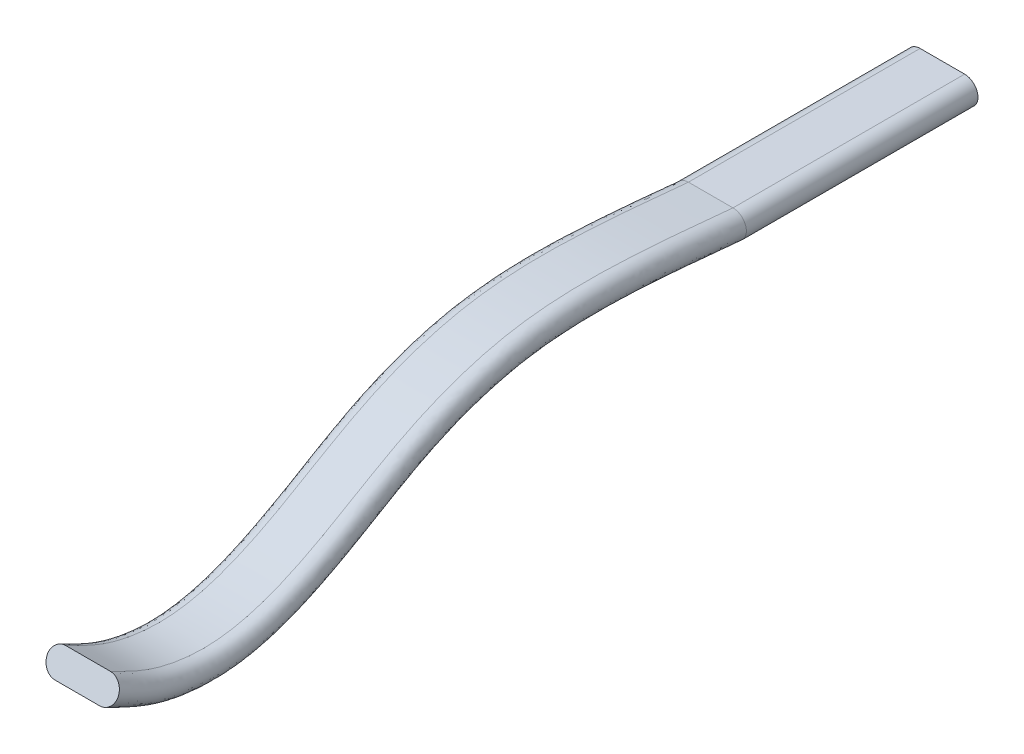
ISO-10303-21;
HEADER;
FILE_DESCRIPTION(('STEP AP214'),'2;1');
FILE_NAME('part.step','',(''),(''),'','','');
FILE_SCHEMA(('AUTOMOTIVE_DESIGN { 1 0 10303 214 1 1 1 1 }'));
ENDSEC;
DATA;
#1=APPLICATION_CONTEXT('core data for automotive mechanical design processes');
#2=APPLICATION_PROTOCOL_DEFINITION('international standard','automotive_design',2000,#1);
#3=PRODUCT_CONTEXT('',#1,'mechanical');
#4=PRODUCT('Part','Part','',(#3));
#5=PRODUCT_RELATED_PRODUCT_CATEGORY('part','',(#4));
#6=PRODUCT_DEFINITION_FORMATION('','',#4);
#7=PRODUCT_DEFINITION_CONTEXT('part definition',#1,'design');
#8=PRODUCT_DEFINITION('design','',#6,#7);
#9=PRODUCT_DEFINITION_SHAPE('','',#8);
#10=(LENGTH_UNIT() NAMED_UNIT(*) SI_UNIT(.MILLI.,.METRE.));
#11=(NAMED_UNIT(*) PLANE_ANGLE_UNIT() SI_UNIT($,.RADIAN.));
#12=(NAMED_UNIT(*) SI_UNIT($,.STERADIAN.) SOLID_ANGLE_UNIT());
#13=UNCERTAINTY_MEASURE_WITH_UNIT(LENGTH_MEASURE(1.E-05),#10,'distance_accuracy_value','');
#14=(GEOMETRIC_REPRESENTATION_CONTEXT(3) GLOBAL_UNCERTAINTY_ASSIGNED_CONTEXT((#13)) GLOBAL_UNIT_ASSIGNED_CONTEXT((#10,
#11,#12)) REPRESENTATION_CONTEXT('',''));
#15=CARTESIAN_POINT('',(0.,0.,0.));
#16=DIRECTION('',(0.,0.,1.));
#17=DIRECTION('',(1.,0.,0.));
#18=AXIS2_PLACEMENT_3D('',#15,#16,#17);
#19=CARTESIAN_POINT('',(0.526780099736162,-0.781783969892824,-2.67375336672806));
#20=DIRECTION('',(0.,0.,1.));
#21=DIRECTION('',(1.,0.,0.));
#22=AXIS2_PLACEMENT_3D('',#19,#20,#21);
#23=CYLINDRICAL_SURFACE('',#22,0.433928571428571);
#24=CARTESIAN_POINT('',(0.526780099736162,-0.781783969892824,4.84767520470051));
#25=DIRECTION('',(0.,0.,1.));
#26=DIRECTION('',(1.,0.,0.));
#27=AXIS2_PLACEMENT_3D('',#24,#25,#26);
#28=CIRCLE('',#27,0.433928571428571);
#29=CARTESIAN_POINT('',(0.526780099736162,-0.347855398464252,4.84767520470051));
#30=VERTEX_POINT('',#29);
#31=CARTESIAN_POINT('',(0.526780099736162,-1.2157125413214,4.84767520470051));
#32=VERTEX_POINT('',#31);
#33=EDGE_CURVE('E97',#30,#32,#28,.T.);
#34=ORIENTED_EDGE('',*,*,#33,.F.);
#35=DIRECTION('',(0.,0.,1.));
#36=VECTOR('',#35,1.);
#37=CARTESIAN_POINT('',(0.526780099736162,-0.347855398464252,-2.67375336672806));
#38=LINE('',#37,#36);
#39=CARTESIAN_POINT('',(0.526780099736162,-0.347855398464252,-2.67375336672806));
#40=VERTEX_POINT('',#39);
#41=EDGE_CURVE('E12',#40,#30,#38,.T.);
#42=ORIENTED_EDGE('',*,*,#41,.F.);
#43=CARTESIAN_POINT('',(0.526780099736162,-0.781783969892824,-2.67375336672806));
#44=DIRECTION('',(0.,0.,1.));
#45=DIRECTION('',(1.,0.,0.));
#46=AXIS2_PLACEMENT_3D('',#43,#44,#45);
#47=CIRCLE('',#46,0.433928571428571);
#48=CARTESIAN_POINT('',(0.526780099736162,-1.2157125413214,-2.67375336672806));
#49=VERTEX_POINT('',#48);
#50=EDGE_CURVE('E124',#40,#49,#47,.T.);
#51=ORIENTED_EDGE('',*,*,#50,.T.);
#52=DIRECTION('',(0.,0.,1.));
#53=VECTOR('',#52,1.);
#54=CARTESIAN_POINT('',(0.526780099736162,-1.2157125413214,-2.67375336672806));
#55=LINE('',#54,#53);
#56=EDGE_CURVE('E44',#49,#32,#55,.T.);
#57=ORIENTED_EDGE('',*,*,#56,.T.);
#58=EDGE_LOOP('',(#34,#42,#51,#57));
#59=FACE_BOUND('',#58,.T.);
#60=ADVANCED_FACE('F41',(#59),#23,.T.);
#61=CARTESIAN_POINT('',(0.526780099736162,-0.347855398464252,-2.67375336672806));
#62=DIRECTION('',(0.,1.,0.));
#63=DIRECTION('',(0.,0.,1.));
#64=AXIS2_PLACEMENT_3D('',#61,#62,#63);
#65=PLANE('',#64);
#66=DIRECTION('',(-1.,0.,0.));
#67=VECTOR('',#66,1.);
#68=CARTESIAN_POINT('',(0.526780099736162,-0.347855398464252,4.84767520470051));
#69=LINE('',#68,#67);
#70=CARTESIAN_POINT('',(1.97320867116473,-0.347855398464252,4.84767520470051));
#71=VERTEX_POINT('',#70);
#72=EDGE_CURVE('E109',#71,#30,#69,.T.);
#73=ORIENTED_EDGE('',*,*,#72,.F.);
#74=DIRECTION('',(0.,0.,1.));
#75=VECTOR('',#74,1.);
#76=CARTESIAN_POINT('',(1.97320867116473,-0.347855398464252,-2.67375336672806));
#77=LINE('',#76,#75);
#78=CARTESIAN_POINT('',(1.97320867116473,-0.347855398464252,-2.67375336672806));
#79=VERTEX_POINT('',#78);
#80=EDGE_CURVE('E50',#79,#71,#77,.T.);
#81=ORIENTED_EDGE('',*,*,#80,.F.);
#82=DIRECTION('',(-1.,0.,0.));
#83=VECTOR('',#82,1.);
#84=CARTESIAN_POINT('',(0.526780099736162,-0.347855398464252,-2.67375336672806));
#85=LINE('',#84,#83);
#86=EDGE_CURVE('E112',#79,#40,#85,.T.);
#87=ORIENTED_EDGE('',*,*,#86,.T.);
#88=ORIENTED_EDGE('',*,*,#41,.T.);
#89=EDGE_LOOP('',(#73,#81,#87,#88));
#90=FACE_BOUND('',#89,.T.);
#91=ADVANCED_FACE('F107',(#90),#65,.T.);
#92=CARTESIAN_POINT('',(1.97320867116473,-0.781783969892824,-2.67375336672806));
#93=DIRECTION('',(0.,0.,1.));
#94=DIRECTION('',(1.,0.,0.));
#95=AXIS2_PLACEMENT_3D('',#92,#93,#94);
#96=CYLINDRICAL_SURFACE('',#95,0.433928571428571);
#97=CARTESIAN_POINT('',(1.97320867116473,-0.781783969892824,4.84767520470051));
#98=DIRECTION('',(0.,0.,1.));
#99=DIRECTION('',(1.,0.,0.));
#100=AXIS2_PLACEMENT_3D('',#97,#98,#99);
#101=CIRCLE('',#100,0.433928571428571);
#102=CARTESIAN_POINT('',(1.97320867116473,-1.2157125413214,4.84767520470051));
#103=VERTEX_POINT('',#102);
#104=EDGE_CURVE('E125',#103,#71,#101,.T.);
#105=ORIENTED_EDGE('',*,*,#104,.F.);
#106=DIRECTION('',(0.,0.,1.));
#107=VECTOR('',#106,1.);
#108=CARTESIAN_POINT('',(1.97320867116473,-1.2157125413214,-2.67375336672806));
#109=LINE('',#108,#107);
#110=CARTESIAN_POINT('',(1.97320867116473,-1.2157125413214,-2.67375336672806));
#111=VERTEX_POINT('',#110);
#112=EDGE_CURVE('E73',#111,#103,#109,.T.);
#113=ORIENTED_EDGE('',*,*,#112,.F.);
#114=CARTESIAN_POINT('',(1.97320867116473,-0.781783969892824,-2.67375336672806));
#115=DIRECTION('',(0.,0.,1.));
#116=DIRECTION('',(1.,0.,0.));
#117=AXIS2_PLACEMENT_3D('',#114,#115,#116);
#118=CIRCLE('',#117,0.433928571428571);
#119=EDGE_CURVE('E132',#111,#79,#118,.T.);
#120=ORIENTED_EDGE('',*,*,#119,.T.);
#121=ORIENTED_EDGE('',*,*,#80,.T.);
#122=EDGE_LOOP('',(#105,#113,#120,#121));
#123=FACE_BOUND('',#122,.T.);
#124=ADVANCED_FACE('F168',(#123),#96,.T.);
#125=CARTESIAN_POINT('',(0.526780099736162,-1.2157125413214,-2.67375336672806));
#126=DIRECTION('',(0.,-1.,0.));
#127=DIRECTION('',(0.,0.,-1.));
#128=AXIS2_PLACEMENT_3D('',#125,#126,#127);
#129=PLANE('',#128);
#130=DIRECTION('',(1.,0.,0.));
#131=VECTOR('',#130,1.);
#132=CARTESIAN_POINT('',(0.526780099736162,-1.2157125413214,4.84767520470051));
#133=LINE('',#132,#131);
#134=EDGE_CURVE('E102',#32,#103,#133,.T.);
#135=ORIENTED_EDGE('',*,*,#134,.F.);
#136=ORIENTED_EDGE('',*,*,#56,.F.);
#137=DIRECTION('',(1.,0.,0.));
#138=VECTOR('',#137,1.);
#139=CARTESIAN_POINT('',(0.526780099736162,-1.2157125413214,-2.67375336672806));
#140=LINE('',#139,#138);
#141=EDGE_CURVE('E127',#49,#111,#140,.T.);
#142=ORIENTED_EDGE('',*,*,#141,.T.);
#143=ORIENTED_EDGE('',*,*,#112,.T.);
#144=EDGE_LOOP('',(#135,#136,#142,#143));
#145=FACE_BOUND('',#144,.T.);
#146=ADVANCED_FACE('F164',(#145),#129,.T.);
#147=CARTESIAN_POINT('',(0.526780099736162,-0.781783969892824,-2.67375336672806));
#148=DIRECTION('',(0.,0.,1.));
#149=DIRECTION('',(1.,0.,0.));
#150=AXIS2_PLACEMENT_3D('',#147,#148,#149);
#151=PLANE('',#150);
#152=ORIENTED_EDGE('',*,*,#50,.F.);
#153=ORIENTED_EDGE('',*,*,#86,.F.);
#154=ORIENTED_EDGE('',*,*,#119,.F.);
#155=ORIENTED_EDGE('',*,*,#141,.F.);
#156=EDGE_LOOP('',(#152,#153,#154,#155));
#157=FACE_BOUND('',#156,.T.);
#158=ADVANCED_FACE('F167',(#157),#151,.F.);
#159=CARTESIAN_POINT('',(0.526780099736162,-3.66872584479644,25.2398042038047));
#160=DIRECTION('',(0.,0.404384129111908,0.914589239015201));
#161=DIRECTION('',(1.,0.,0.));
#162=AXIS2_PLACEMENT_3D('',#159,#160,#161);
#163=PLANE('',#162);
#164=CARTESIAN_POINT('',(0.526780099736162,-3.66872584479644,25.2398042038047));
#165=DIRECTION('',(0.,0.404384129111908,0.914589239015201));
#166=DIRECTION('',(1.,0.,0.));
#167=AXIS2_PLACEMENT_3D('',#164,#165,#166);
#168=CIRCLE('',#167,0.433928571428571);
#169=CARTESIAN_POINT('',(0.526780099736162,-3.27185944286663,25.0643303763508));
#170=VERTEX_POINT('',#169);
#171=CARTESIAN_POINT('',(0.526780099736161,-4.06559224672626,25.4152780312586));
#172=VERTEX_POINT('',#171);
#173=EDGE_CURVE('E117',#170,#172,#168,.T.);
#174=ORIENTED_EDGE('',*,*,#173,.T.);
#175=DIRECTION('',(1.,0.,0.));
#176=VECTOR('',#175,1.);
#177=CARTESIAN_POINT('',(0.526780099736161,-4.06559224672626,25.4152780312586));
#178=LINE('',#177,#176);
#179=CARTESIAN_POINT('',(1.97320867116473,-4.06559224672626,25.4152780312586));
#180=VERTEX_POINT('',#179);
#181=EDGE_CURVE('E275',#172,#180,#178,.T.);
#182=ORIENTED_EDGE('',*,*,#181,.T.);
#183=CARTESIAN_POINT('',(1.97320867116473,-3.66872584479645,25.2398042038047));
#184=DIRECTION('',(0.,0.404384129111908,0.914589239015201));
#185=DIRECTION('',(1.,0.,0.));
#186=AXIS2_PLACEMENT_3D('',#183,#184,#185);
#187=CIRCLE('',#186,0.433928571428571);
#188=CARTESIAN_POINT('',(1.97320867116473,-3.27185944286663,25.0643303763508));
#189=VERTEX_POINT('',#188);
#190=EDGE_CURVE('E147',#180,#189,#187,.T.);
#191=ORIENTED_EDGE('',*,*,#190,.T.);
#192=DIRECTION('',(-1.,0.,0.));
#193=VECTOR('',#192,1.);
#194=CARTESIAN_POINT('',(0.526780099736162,-3.27185944286663,25.0643303763508));
#195=LINE('',#194,#193);
#196=EDGE_CURVE('E150',#189,#170,#195,.T.);
#197=ORIENTED_EDGE('',*,*,#196,.T.);
#198=EDGE_LOOP('',(#174,#182,#191,#197));
#199=FACE_BOUND('',#198,.T.);
#200=ADVANCED_FACE('F202',(#199),#163,.T.);
#201=CARTESIAN_POINT('',(1.97320867116473,-0.347855398464252,4.84767520470051));
#202=CARTESIAN_POINT('',(1.97320867116473,-0.237773598344045,6.0228038470855));
#203=CARTESIAN_POINT('',(1.97320867116473,0.00191392639273234,8.33560544019088));
#204=CARTESIAN_POINT('',(1.97320867116473,-0.0163151759276791,12.052337814414));
#205=CARTESIAN_POINT('',(1.97320867116473,-1.13584551232427,15.2310981323531));
#206=CARTESIAN_POINT('',(1.97320867116473,-2.72627650517268,17.7772754686209));
#207=CARTESIAN_POINT('',(1.97320867116473,-3.66235989034802,19.5806596124063));
#208=CARTESIAN_POINT('',(1.97320867116473,-4.0535019938743,20.9604301286208));
#209=CARTESIAN_POINT('',(1.97320867116473,-4.16819108851048,21.9015605817675));
#210=CARTESIAN_POINT('',(1.97320867116473,-4.10261746977848,22.8832451794184));
#211=CARTESIAN_POINT('',(1.97320867116473,-3.85030214273174,23.9197344161867));
#212=CARTESIAN_POINT('',(1.97320867116473,-3.464673676155,24.6827983896294));
#213=CARTESIAN_POINT('',(1.97320867116473,-3.27185944286663,25.0643303763508));
#214=CARTESIAN_POINT('',(1.49106581402188,-0.347855398464252,4.84767520470051));
#215=CARTESIAN_POINT('',(1.49106581402188,-0.237184411622656,6.02909344437826));
#216=CARTESIAN_POINT('',(1.49106581402188,0.00164026478433113,8.33268408903199));
#217=CARTESIAN_POINT('',(1.49106581402188,-0.0162411403803595,12.053128147531));
#218=CARTESIAN_POINT('',(1.49106581402188,-1.13585994989446,15.2309440105797));
#219=CARTESIAN_POINT('',(1.49106581402188,-2.72627302030837,17.7773126697192));
#220=CARTESIAN_POINT('',(1.49106581402188,-3.66236022867955,19.5806560007006));
#221=CARTESIAN_POINT('',(1.49106581402188,-4.05350193839388,20.9604307208771));
#222=CARTESIAN_POINT('',(1.49106581402188,-4.16819110337131,21.9015604231274));
#223=CARTESIAN_POINT('',(1.49106581402188,-4.10261746581559,22.8832452217225));
#224=CARTESIAN_POINT('',(1.49106581402188,-3.85030214372246,23.9197344056107));
#225=CARTESIAN_POINT('',(1.49106581402188,-3.46467367648524,24.6827983861041));
#226=CARTESIAN_POINT('',(1.49106581402188,-3.27185944286663,25.0643303763508));
#227=CARTESIAN_POINT('',(1.00892295687902,-0.347855398464252,4.84767520470051));
#228=CARTESIAN_POINT('',(1.00892295687902,-0.237184411622656,6.02909344437826));
#229=CARTESIAN_POINT('',(1.00892295687902,0.001640264784331,8.33268408903199));
#230=CARTESIAN_POINT('',(1.00892295687902,-0.016241140380359,12.053128147531));
#231=CARTESIAN_POINT('',(1.00892295687902,-1.13585994989446,15.2309440105797));
#232=CARTESIAN_POINT('',(1.00892295687902,-2.72627302030837,17.7773126697192));
#233=CARTESIAN_POINT('',(1.00892295687902,-3.66236022867955,19.5806560007006));
#234=CARTESIAN_POINT('',(1.00892295687902,-4.05350193839387,20.9604307208771));
#235=CARTESIAN_POINT('',(1.00892295687902,-4.16819110337131,21.9015604231274));
#236=CARTESIAN_POINT('',(1.00892295687902,-4.10261746581559,22.8832452217225));
#237=CARTESIAN_POINT('',(1.00892295687902,-3.85030214372246,23.9197344056107));
#238=CARTESIAN_POINT('',(1.00892295687902,-3.46467367648524,24.6827983861041));
#239=CARTESIAN_POINT('',(1.00892295687902,-3.27185944286663,25.0643303763508));
#240=CARTESIAN_POINT('',(0.526780099736162,-0.347855398464252,4.84767520470051));
#241=CARTESIAN_POINT('',(0.526780099736162,-0.237773598344045,6.0228038470855));
#242=CARTESIAN_POINT('',(0.526780099736161,0.00191392639273183,8.33560544019088));
#243=CARTESIAN_POINT('',(0.526780099736162,-0.0163151759276774,12.052337814414));
#244=CARTESIAN_POINT('',(0.526780099736162,-1.13584551232427,15.2310981323531));
#245=CARTESIAN_POINT('',(0.526780099736162,-2.72627650517268,17.7772754686209));
#246=CARTESIAN_POINT('',(0.526780099736162,-3.66235989034802,19.5806596124063));
#247=CARTESIAN_POINT('',(0.526780099736162,-4.0535019938743,20.9604301286208));
#248=CARTESIAN_POINT('',(0.526780099736162,-4.16819108851048,21.9015605817675));
#249=CARTESIAN_POINT('',(0.526780099736162,-4.10261746977848,22.8832451794184));
#250=CARTESIAN_POINT('',(0.526780099736162,-3.85030214273174,23.9197344161867));
#251=CARTESIAN_POINT('',(0.526780099736162,-3.464673676155,24.6827983896294));
#252=CARTESIAN_POINT('',(0.526780099736162,-3.27185944286663,25.0643303763508));
#253=B_SPLINE_SURFACE_WITH_KNOTS('',3,3,((#201,#202,#203,#204,#205,#206,#207,#208,#209,#210,
#211,#212,#213),(#214,#215,#216,#217,#218,#219,#220,#221,#222,#223,#224,#225,#226),(#227,#228,
#229,#230,#231,#232,#233,#234,#235,#236,#237,#238,#239),(#240,#241,#242,#243,#244,#245,#246,
#247,#248,#249,#250,#251,#252)),.UNSPECIFIED.,.F.,.F.,.F.,(4,4),(4,1,1,1,1,1,1,1,1,1,4),(0.6875,
1.),(0.,0.166666666666668,0.333333333333294,0.5,0.625,0.75,0.8,0.85,0.9,0.95,1.),.UNSPECIFIED.);
#254=CARTESIAN_POINT('',(0.526780099736161,-0.347855398464252,4.84767520470051));
#255=CARTESIAN_POINT('',(0.526780099736161,-0.237773598344045,6.0228038470855));
#256=CARTESIAN_POINT('',(0.526780099736161,0.00191392639273171,8.33560544019088));
#257=CARTESIAN_POINT('',(0.526780099736162,-0.0163151759276775,12.052337814414));
#258=CARTESIAN_POINT('',(0.526780099736162,-1.13584551232427,15.2310981323531));
#259=CARTESIAN_POINT('',(0.526780099736162,-2.72627650517268,17.7772754686209));
#260=CARTESIAN_POINT('',(0.526780099736162,-3.66235989034802,19.5806596124063));
#261=CARTESIAN_POINT('',(0.526780099736162,-4.0535019938743,20.9604301286208));
#262=CARTESIAN_POINT('',(0.526780099736162,-4.16819108851048,21.9015605817675));
#263=CARTESIAN_POINT('',(0.526780099736162,-4.10261746977848,22.8832451794184));
#264=CARTESIAN_POINT('',(0.526780099736162,-3.85030214273174,23.9197344161867));
#265=CARTESIAN_POINT('',(0.526780099736162,-3.464673676155,24.6827983896294));
#266=CARTESIAN_POINT('',(0.526780099736162,-3.27185944286663,25.0643303763508));
#267=B_SPLINE_CURVE_WITH_KNOTS('',3,(#254,#255,#256,#257,#258,#259,#260,#261,#262,#263,#264,
#265,#266),.UNSPECIFIED.,.F.,.F.,(4,1,1,1,1,1,1,1,1,1,4),(0.,0.166666666666668,
0.333333333333294,0.5,0.625,0.75,0.8,0.85,0.9,0.95,1.),.UNSPECIFIED.);
#268=EDGE_CURVE('E103',#30,#170,#267,.T.);
#269=CARTESIAN_POINT('',(1.97320867116473,-0.347855398464252,4.84767520470051));
#270=CARTESIAN_POINT('',(1.97320867116473,-0.237773598344045,6.0228038470855));
#271=CARTESIAN_POINT('',(1.97320867116473,0.00191392639273234,8.33560544019088));
#272=CARTESIAN_POINT('',(1.97320867116473,-0.0163151759276791,12.052337814414));
#273=CARTESIAN_POINT('',(1.97320867116473,-1.13584551232427,15.2310981323531));
#274=CARTESIAN_POINT('',(1.97320867116473,-2.72627650517268,17.7772754686209));
#275=CARTESIAN_POINT('',(1.97320867116473,-3.66235989034802,19.5806596124063));
#276=CARTESIAN_POINT('',(1.97320867116473,-4.0535019938743,20.9604301286208));
#277=CARTESIAN_POINT('',(1.97320867116473,-4.16819108851048,21.9015605817675));
#278=CARTESIAN_POINT('',(1.97320867116473,-4.10261746977848,22.8832451794184));
#279=CARTESIAN_POINT('',(1.97320867116473,-3.85030214273174,23.9197344161867));
#280=CARTESIAN_POINT('',(1.97320867116473,-3.464673676155,24.6827983896294));
#281=CARTESIAN_POINT('',(1.97320867116473,-3.27185944286663,25.0643303763508));
#282=B_SPLINE_CURVE_WITH_KNOTS('',3,(#269,#270,#271,#272,#273,#274,#275,#276,#277,#278,#279,
#280,#281),.UNSPECIFIED.,.F.,.F.,(4,1,1,1,1,1,1,1,1,1,4),(0.,0.166666666666668,
0.333333333333294,0.5,0.625,0.75,0.8,0.85,0.9,0.95,1.),.UNSPECIFIED.);
#283=EDGE_CURVE('E120',#71,#189,#282,.T.);
#284=ORIENTED_EDGE('',*,*,#72,.T.);
#285=ORIENTED_EDGE('',*,*,#268,.T.);
#286=ORIENTED_EDGE('',*,*,#196,.F.);
#287=ORIENTED_EDGE('',*,*,#283,.F.);
#288=EDGE_LOOP('',(#284,#285,#286,#287));
#289=FACE_BOUND('',#288,.T.);
#290=ADVANCED_FACE('F123',(#289),#253,.T.);
#291=CARTESIAN_POINT('',(1.97320867116473,-1.2157125413214,4.84767520470051));
#292=CARTESIAN_POINT('',(1.97320867116473,-1.10690338451939,6.00921831693315));
#293=CARTESIAN_POINT('',(1.97320867116473,-0.863653721038825,8.32408971589233));
#294=CARTESIAN_POINT('',(1.97320867116473,-0.884419271779599,11.866109309463));
#295=CARTESIAN_POINT('',(1.97320867116473,-1.85820005422457,14.7346256120417));
#296=CARTESIAN_POINT('',(1.97320867116473,-3.41742349233677,17.2563195628657));
#297=CARTESIAN_POINT('',(1.97320867116473,-4.42568774009674,19.1530263808066));
#298=CARTESIAN_POINT('',(1.97320867116473,-4.88489432347439,20.6992844671516));
#299=CARTESIAN_POINT('',(1.97320867116473,-5.03350996834479,21.7870192793937));
#300=CARTESIAN_POINT('',(1.97320867116473,-4.97428411611862,22.9362333390928));
#301=CARTESIAN_POINT('',(1.97320867116473,-4.69584950072705,24.1385339059814));
#302=CARTESIAN_POINT('',(1.97320867116473,-4.27567799805985,24.9896966561662));
#303=CARTESIAN_POINT('',(1.97320867116473,-4.06559224672626,25.4152780312586));
#304=CARTESIAN_POINT('',(2.84106581402188,-1.2157125413214,4.84767520470051));
#305=CARTESIAN_POINT('',(2.84106581402188,-1.10654987248656,6.01299207530881));
#306=CARTESIAN_POINT('',(2.84106581402188,-0.863817918003865,8.322336905197));
#307=CARTESIAN_POINT('',(2.84106581402187,-0.884374850451208,11.8665835093332));
#308=CARTESIAN_POINT('',(2.84106581402188,-1.85820871676668,14.7345331389777));
#309=CARTESIAN_POINT('',(2.84106581402188,-3.41742140141818,17.2563418835246));
#310=CARTESIAN_POINT('',(2.84106581402187,-4.42568794309566,19.1530242137831));
#311=CARTESIAN_POINT('',(2.84106581402188,-4.88489429018613,20.6992848225054));
#312=CARTESIAN_POINT('',(2.84106581402188,-5.03350997726129,21.7870191842096));
#313=CARTESIAN_POINT('',(2.84106581402188,-4.97428411374089,22.9362333644752));
#314=CARTESIAN_POINT('',(2.84106581402188,-4.69584950132149,24.1385338996358));
#315=CARTESIAN_POINT('',(2.84106581402188,-4.275677998258,24.989696654051));
#316=CARTESIAN_POINT('',(2.84106581402188,-4.06559224672626,25.4152780312586));
#317=CARTESIAN_POINT('',(2.84106581402188,-0.347855398464252,4.84767520470051));
#318=CARTESIAN_POINT('',(2.84106581402188,-0.238127110376879,6.01903008870985));
#319=CARTESIAN_POINT('',(2.84106581402187,0.00207812335777261,8.3373582508862));
#320=CARTESIAN_POINT('',(2.84106581402188,-0.0163595972560713,12.0518636145438));
#321=CARTESIAN_POINT('',(2.84106581402188,-1.13583684978215,15.2311906054172));
#322=CARTESIAN_POINT('',(2.84106581402188,-2.72627859609126,17.7772531479619));
#323=CARTESIAN_POINT('',(2.84106581402188,-3.6623596873491,19.5806617794298));
#324=CARTESIAN_POINT('',(2.84106581402188,-4.05350202716256,20.960429773267));
#325=CARTESIAN_POINT('',(2.84106581402188,-4.16819107959398,21.9015606769515));
#326=CARTESIAN_POINT('',(2.84106581402188,-4.10261747215621,22.883245154036));
#327=CARTESIAN_POINT('',(2.84106581402188,-3.85030214213731,23.9197344225323));
#328=CARTESIAN_POINT('',(2.84106581402188,-3.46467367595686,24.6827983917446));
#329=CARTESIAN_POINT('',(2.84106581402188,-3.27185944286664,25.0643303763508));
#330=CARTESIAN_POINT('',(1.97320867116473,-0.347855398464252,4.84767520470051));
#331=CARTESIAN_POINT('',(1.97320867116473,-0.237773598344045,6.0228038470855));
#332=CARTESIAN_POINT('',(1.97320867116473,0.00191392639273234,8.33560544019088));
#333=CARTESIAN_POINT('',(1.97320867116473,-0.0163151759276791,12.052337814414));
#334=CARTESIAN_POINT('',(1.97320867116473,-1.13584551232427,15.2310981323531));
#335=CARTESIAN_POINT('',(1.97320867116473,-2.72627650517268,17.7772754686209));
#336=CARTESIAN_POINT('',(1.97320867116473,-3.66235989034802,19.5806596124063));
#337=CARTESIAN_POINT('',(1.97320867116473,-4.0535019938743,20.9604301286208));
#338=CARTESIAN_POINT('',(1.97320867116473,-4.16819108851048,21.9015605817675));
#339=CARTESIAN_POINT('',(1.97320867116473,-4.10261746977848,22.8832451794184));
#340=CARTESIAN_POINT('',(1.97320867116473,-3.85030214273174,23.9197344161867));
#341=CARTESIAN_POINT('',(1.97320867116473,-3.464673676155,24.6827983896294));
#342=CARTESIAN_POINT('',(1.97320867116473,-3.27185944286663,25.0643303763508));
#343=(BOUNDED_SURFACE() B_SPLINE_SURFACE(3,3,((#291,#292,#293,#294,#295,#296,#297,#298,#299,
#300,#301,#302,#303),(#304,#305,#306,#307,#308,#309,#310,#311,#312,#313,#314,#315,#316),(#317,
#318,#319,#320,#321,#322,#323,#324,#325,#326,#327,#328,#329),(#330,#331,#332,#333,#334,#335,
#336,#337,#338,#339,#340,#341,#342)),.UNSPECIFIED.,.F.,.F.,.F.) B_SPLINE_SURFACE_WITH_KNOTS((4,
4),(4,1,1,1,1,1,1,1,1,1,4),(0.5,0.6875),(0.,0.166666666666668,0.333333333333294,0.5,0.625,0.75,
0.8,0.85,0.9,0.95,1.),
.UNSPECIFIED.) GEOMETRIC_REPRESENTATION_ITEM() RATIONAL_B_SPLINE_SURFACE(((1.,1.,1.,1.,1.,1.,1.,
1.,1.,1.,1.,1.,1.),(0.333333333333333,0.333333333333333,0.333333333333333,0.333333333333333,
0.333333333333333,0.333333333333333,0.333333333333333,0.333333333333333,0.333333333333333,
0.333333333333333,0.333333333333333,0.333333333333333,0.333333333333333),(0.333333333333333,
0.333333333333333,0.333333333333333,0.333333333333333,0.333333333333333,0.333333333333333,
0.333333333333333,0.333333333333333,0.333333333333333,0.333333333333333,0.333333333333333,
0.333333333333333,0.333333333333333),(1.,1.,1.,1.,1.,1.,1.,1.,1.,1.,1.,1.,1.))) REPRESENTATION_ITEM('') SURFACE());
#344=CARTESIAN_POINT('',(1.97320867116473,-1.2157125413214,4.84767520470051));
#345=CARTESIAN_POINT('',(1.97320867116473,-1.10690338451939,6.00921831693315));
#346=CARTESIAN_POINT('',(1.97320867116473,-0.863653721038825,8.32408971589233));
#347=CARTESIAN_POINT('',(1.97320867116473,-0.884419271779599,11.866109309463));
#348=CARTESIAN_POINT('',(1.97320867116473,-1.85820005422457,14.7346256120417));
#349=CARTESIAN_POINT('',(1.97320867116473,-3.41742349233677,17.2563195628657));
#350=CARTESIAN_POINT('',(1.97320867116473,-4.42568774009674,19.1530263808066));
#351=CARTESIAN_POINT('',(1.97320867116473,-4.88489432347439,20.6992844671516));
#352=CARTESIAN_POINT('',(1.97320867116473,-5.03350996834479,21.7870192793936));
#353=CARTESIAN_POINT('',(1.97320867116473,-4.97428411611862,22.9362333390928));
#354=CARTESIAN_POINT('',(1.97320867116473,-4.69584950072705,24.1385339059814));
#355=CARTESIAN_POINT('',(1.97320867116473,-4.27567799805985,24.9896966561662));
#356=CARTESIAN_POINT('',(1.97320867116473,-4.06559224672626,25.4152780312586));
#357=B_SPLINE_CURVE_WITH_KNOTS('',3,(#344,#345,#346,#347,#348,#349,#350,#351,#352,#353,#354,
#355,#356),.UNSPECIFIED.,.F.,.F.,(4,1,1,1,1,1,1,1,1,1,4),(0.,0.166666666666668,
0.333333333333294,0.5,0.625,0.75,0.8,0.85,0.9,0.95,1.),.UNSPECIFIED.);
#358=EDGE_CURVE('E141',#103,#180,#357,.T.);
#359=ORIENTED_EDGE('',*,*,#104,.T.);
#360=ORIENTED_EDGE('',*,*,#283,.T.);
#361=ORIENTED_EDGE('',*,*,#190,.F.);
#362=ORIENTED_EDGE('',*,*,#358,.F.);
#363=EDGE_LOOP('',(#359,#360,#361,#362));
#364=FACE_BOUND('',#363,.T.);
#365=ADVANCED_FACE('F145',(#364),#343,.T.);
#366=CARTESIAN_POINT('',(0.526780099736162,-1.2157125413214,4.84767520470051));
#367=CARTESIAN_POINT('',(0.526780099736162,-1.10690338451939,6.00921831693315));
#368=CARTESIAN_POINT('',(0.526780099736162,-0.863653721038825,8.32408971589233));
#369=CARTESIAN_POINT('',(0.526780099736161,-0.884419271779597,11.866109309463));
#370=CARTESIAN_POINT('',(0.526780099736161,-1.85820005422457,14.7346256120417));
#371=CARTESIAN_POINT('',(0.526780099736161,-3.41742349233677,17.2563195628657));
#372=CARTESIAN_POINT('',(0.526780099736161,-4.42568774009674,19.1530263808066));
#373=CARTESIAN_POINT('',(0.526780099736161,-4.88489432347439,20.6992844671516));
#374=CARTESIAN_POINT('',(0.526780099736161,-5.03350996834479,21.7870192793936));
#375=CARTESIAN_POINT('',(0.526780099736161,-4.97428411611862,22.9362333390928));
#376=CARTESIAN_POINT('',(0.526780099736161,-4.69584950072705,24.1385339059814));
#377=CARTESIAN_POINT('',(0.526780099736161,-4.27567799805985,24.9896966561662));
#378=CARTESIAN_POINT('',(0.526780099736161,-4.06559224672626,25.4152780312586));
#379=CARTESIAN_POINT('',(1.00892295687902,-1.2157125413214,4.84767520470051));
#380=CARTESIAN_POINT('',(1.00892295687902,-1.10749257124078,6.0029287196404));
#381=CARTESIAN_POINT('',(1.00892295687902,-0.863380059430424,8.32701106705121));
#382=CARTESIAN_POINT('',(1.00892295687902,-0.884493307326917,11.865318976346));
#383=CARTESIAN_POINT('',(1.00892295687902,-1.85818561665437,14.7347797338152));
#384=CARTESIAN_POINT('',(1.00892295687902,-3.41742697720107,17.2562823617674));
#385=CARTESIAN_POINT('',(1.00892295687902,-4.42568740176521,19.1530299925124));
#386=CARTESIAN_POINT('',(1.00892295687902,-4.88489437895482,20.6992838748953));
#387=CARTESIAN_POINT('',(1.00892295687902,-5.03350995348396,21.7870194380337));
#388=CARTESIAN_POINT('',(1.00892295687902,-4.97428412008151,22.9362332967888));
#389=CARTESIAN_POINT('',(1.00892295687902,-4.69584949973633,24.1385339165574));
#390=CARTESIAN_POINT('',(1.00892295687902,-4.27567799772961,24.9896966596915));
#391=CARTESIAN_POINT('',(1.00892295687902,-4.06559224672626,25.4152780312586));
#392=CARTESIAN_POINT('',(1.49106581402188,-1.2157125413214,4.84767520470051));
#393=CARTESIAN_POINT('',(1.49106581402188,-1.10749257124078,6.0029287196404));
#394=CARTESIAN_POINT('',(1.49106581402188,-0.863380059430424,8.32701106705121));
#395=CARTESIAN_POINT('',(1.49106581402188,-0.884493307326917,11.865318976346));
#396=CARTESIAN_POINT('',(1.49106581402188,-1.85818561665437,14.7347797338152));
#397=CARTESIAN_POINT('',(1.49106581402188,-3.41742697720107,17.2562823617674));
#398=CARTESIAN_POINT('',(1.49106581402188,-4.42568740176521,19.1530299925124));
#399=CARTESIAN_POINT('',(1.49106581402188,-4.88489437895482,20.6992838748953));
#400=CARTESIAN_POINT('',(1.49106581402188,-5.03350995348396,21.7870194380337));
#401=CARTESIAN_POINT('',(1.49106581402188,-4.97428412008151,22.9362332967888));
#402=CARTESIAN_POINT('',(1.49106581402188,-4.69584949973633,24.1385339165574));
#403=CARTESIAN_POINT('',(1.49106581402188,-4.27567799772961,24.9896966596915));
#404=CARTESIAN_POINT('',(1.49106581402188,-4.06559224672626,25.4152780312586));
#405=CARTESIAN_POINT('',(1.97320867116473,-1.2157125413214,4.84767520470051));
#406=CARTESIAN_POINT('',(1.97320867116473,-1.10690338451939,6.00921831693315));
#407=CARTESIAN_POINT('',(1.97320867116473,-0.863653721038825,8.32408971589233));
#408=CARTESIAN_POINT('',(1.97320867116473,-0.884419271779599,11.866109309463));
#409=CARTESIAN_POINT('',(1.97320867116473,-1.85820005422457,14.7346256120417));
#410=CARTESIAN_POINT('',(1.97320867116473,-3.41742349233677,17.2563195628657));
#411=CARTESIAN_POINT('',(1.97320867116473,-4.42568774009674,19.1530263808066));
#412=CARTESIAN_POINT('',(1.97320867116473,-4.88489432347439,20.6992844671516));
#413=CARTESIAN_POINT('',(1.97320867116473,-5.03350996834479,21.7870192793936));
#414=CARTESIAN_POINT('',(1.97320867116473,-4.97428411611862,22.9362333390928));
#415=CARTESIAN_POINT('',(1.97320867116473,-4.69584950072705,24.1385339059814));
#416=CARTESIAN_POINT('',(1.97320867116473,-4.27567799805985,24.9896966561662));
#417=CARTESIAN_POINT('',(1.97320867116473,-4.06559224672626,25.4152780312586));
#418=B_SPLINE_SURFACE_WITH_KNOTS('',3,3,((#366,#367,#368,#369,#370,#371,#372,#373,#374,#375,
#376,#377,#378),(#379,#380,#381,#382,#383,#384,#385,#386,#387,#388,#389,#390,#391),(#392,#393,
#394,#395,#396,#397,#398,#399,#400,#401,#402,#403,#404),(#405,#406,#407,#408,#409,#410,#411,
#412,#413,#414,#415,#416,#417)),.UNSPECIFIED.,.F.,.F.,.F.,(4,4),(4,1,1,1,1,1,1,1,1,1,4),(0.1875,
0.5),(0.,0.166666666666668,0.333333333333294,0.5,0.625,0.75,0.8,0.85,0.9,0.95,1.),.UNSPECIFIED.);
#419=CARTESIAN_POINT('',(0.526780099736162,-1.2157125413214,4.84767520470051));
#420=CARTESIAN_POINT('',(0.526780099736162,-1.10690338451939,6.00921831693315));
#421=CARTESIAN_POINT('',(0.526780099736162,-0.863653721038825,8.32408971589233));
#422=CARTESIAN_POINT('',(0.526780099736161,-0.884419271779597,11.866109309463));
#423=CARTESIAN_POINT('',(0.526780099736161,-1.85820005422457,14.7346256120417));
#424=CARTESIAN_POINT('',(0.526780099736161,-3.41742349233677,17.2563195628657));
#425=CARTESIAN_POINT('',(0.526780099736161,-4.42568774009674,19.1530263808066));
#426=CARTESIAN_POINT('',(0.526780099736161,-4.88489432347439,20.6992844671516));
#427=CARTESIAN_POINT('',(0.526780099736161,-5.03350996834479,21.7870192793936));
#428=CARTESIAN_POINT('',(0.526780099736161,-4.97428411611862,22.9362333390928));
#429=CARTESIAN_POINT('',(0.526780099736161,-4.69584950072705,24.1385339059814));
#430=CARTESIAN_POINT('',(0.526780099736161,-4.27567799805985,24.9896966561662));
#431=CARTESIAN_POINT('',(0.526780099736161,-4.06559224672626,25.4152780312586));
#432=B_SPLINE_CURVE_WITH_KNOTS('',3,(#419,#420,#421,#422,#423,#424,#425,#426,#427,#428,#429,
#430,#431),.UNSPECIFIED.,.F.,.F.,(4,1,1,1,1,1,1,1,1,1,4),(0.,0.166666666666668,
0.333333333333294,0.5,0.625,0.75,0.8,0.85,0.9,0.95,1.),.UNSPECIFIED.);
#433=EDGE_CURVE('E143',#32,#172,#432,.T.);
#434=ORIENTED_EDGE('',*,*,#134,.T.);
#435=ORIENTED_EDGE('',*,*,#358,.T.);
#436=ORIENTED_EDGE('',*,*,#181,.F.);
#437=ORIENTED_EDGE('',*,*,#433,.F.);
#438=EDGE_LOOP('',(#434,#435,#436,#437));
#439=FACE_BOUND('',#438,.T.);
#440=ADVANCED_FACE('F140',(#439),#418,.T.);
#441=CARTESIAN_POINT('',(0.526780099736161,-0.347855398464252,4.84767520470051));
#442=CARTESIAN_POINT('',(0.526780099736161,-0.237773598344045,6.0228038470855));
#443=CARTESIAN_POINT('',(0.526780099736161,0.00191392639273171,8.33560544019088));
#444=CARTESIAN_POINT('',(0.526780099736162,-0.0163151759276775,12.052337814414));
#445=CARTESIAN_POINT('',(0.526780099736162,-1.13584551232427,15.2310981323531));
#446=CARTESIAN_POINT('',(0.526780099736162,-2.72627650517268,17.7772754686209));
#447=CARTESIAN_POINT('',(0.526780099736162,-3.66235989034802,19.5806596124063));
#448=CARTESIAN_POINT('',(0.526780099736162,-4.0535019938743,20.9604301286208));
#449=CARTESIAN_POINT('',(0.526780099736162,-4.16819108851048,21.9015605817675));
#450=CARTESIAN_POINT('',(0.526780099736162,-4.10261746977848,22.8832451794184));
#451=CARTESIAN_POINT('',(0.526780099736162,-3.85030214273174,23.9197344161867));
#452=CARTESIAN_POINT('',(0.526780099736162,-3.464673676155,24.6827983896294));
#453=CARTESIAN_POINT('',(0.526780099736162,-3.27185944286663,25.0643303763508));
#454=CARTESIAN_POINT('',(-0.34107704312098,-0.347855398464253,4.84767520470051));
#455=CARTESIAN_POINT('',(-0.34107704312098,-0.238127110376879,6.01903008870985));
#456=CARTESIAN_POINT('',(-0.341077043120981,0.00207812335777139,8.33735825088621));
#457=CARTESIAN_POINT('',(-0.34107704312098,-0.0163595972560684,12.0518636145438));
#458=CARTESIAN_POINT('',(-0.34107704312098,-1.13583684978215,15.2311906054172));
#459=CARTESIAN_POINT('',(-0.34107704312098,-2.72627859609126,17.7772531479619));
#460=CARTESIAN_POINT('',(-0.341077043120981,-3.6623596873491,19.5806617794298));
#461=CARTESIAN_POINT('',(-0.34107704312098,-4.05350202716256,20.960429773267));
#462=CARTESIAN_POINT('',(-0.34107704312098,-4.16819107959398,21.9015606769515));
#463=CARTESIAN_POINT('',(-0.34107704312098,-4.10261747215621,22.883245154036));
#464=CARTESIAN_POINT('',(-0.34107704312098,-3.85030214213731,23.9197344225323));
#465=CARTESIAN_POINT('',(-0.34107704312098,-3.46467367595686,24.6827983917446));
#466=CARTESIAN_POINT('',(-0.34107704312098,-3.27185944286663,25.0643303763508));
#467=CARTESIAN_POINT('',(-0.34107704312098,-1.21571254132139,4.84767520470051));
#468=CARTESIAN_POINT('',(-0.34107704312098,-1.10654987248656,6.01299207530881));
#469=CARTESIAN_POINT('',(-0.34107704312098,-0.863817918003866,8.32233690519701));
#470=CARTESIAN_POINT('',(-0.341077043120981,-0.884374850451205,11.8665835093332));
#471=CARTESIAN_POINT('',(-0.341077043120981,-1.85820871676668,14.7345331389777));
#472=CARTESIAN_POINT('',(-0.341077043120981,-3.41742140141818,17.2563418835246));
#473=CARTESIAN_POINT('',(-0.341077043120981,-4.42568794309566,19.1530242137832));
#474=CARTESIAN_POINT('',(-0.341077043120981,-4.88489429018613,20.6992848225054));
#475=CARTESIAN_POINT('',(-0.341077043120981,-5.03350997726129,21.7870191842096));
#476=CARTESIAN_POINT('',(-0.341077043120981,-4.97428411374089,22.9362333644752));
#477=CARTESIAN_POINT('',(-0.341077043120981,-4.69584950132149,24.1385338996358));
#478=CARTESIAN_POINT('',(-0.341077043120981,-4.275677998258,24.989696654051));
#479=CARTESIAN_POINT('',(-0.341077043120981,-4.06559224672626,25.4152780312586));
#480=CARTESIAN_POINT('',(0.526780099736162,-1.2157125413214,4.84767520470051));
#481=CARTESIAN_POINT('',(0.526780099736162,-1.10690338451939,6.00921831693315));
#482=CARTESIAN_POINT('',(0.526780099736162,-0.863653721038825,8.32408971589233));
#483=CARTESIAN_POINT('',(0.526780099736161,-0.884419271779597,11.866109309463));
#484=CARTESIAN_POINT('',(0.526780099736161,-1.85820005422457,14.7346256120417));
#485=CARTESIAN_POINT('',(0.526780099736161,-3.41742349233677,17.2563195628657));
#486=CARTESIAN_POINT('',(0.526780099736161,-4.42568774009674,19.1530263808066));
#487=CARTESIAN_POINT('',(0.526780099736161,-4.88489432347439,20.6992844671516));
#488=CARTESIAN_POINT('',(0.526780099736161,-5.03350996834479,21.7870192793937));
#489=CARTESIAN_POINT('',(0.526780099736161,-4.97428411611862,22.9362333390928));
#490=CARTESIAN_POINT('',(0.526780099736161,-4.69584950072705,24.1385339059814));
#491=CARTESIAN_POINT('',(0.526780099736161,-4.27567799805985,24.9896966561662));
#492=CARTESIAN_POINT('',(0.526780099736161,-4.06559224672626,25.4152780312586));
#493=(BOUNDED_SURFACE() B_SPLINE_SURFACE(3,3,((#441,#442,#443,#444,#445,#446,#447,#448,#449,
#450,#451,#452,#453),(#454,#455,#456,#457,#458,#459,#460,#461,#462,#463,#464,#465,#466),(#467,
#468,#469,#470,#471,#472,#473,#474,#475,#476,#477,#478,#479),(#480,#481,#482,#483,#484,#485,
#486,#487,#488,#489,#490,#491,#492)),.UNSPECIFIED.,.F.,.F.,.F.) B_SPLINE_SURFACE_WITH_KNOTS((4,
4),(4,1,1,1,1,1,1,1,1,1,4),(0.,0.1875),(0.,0.166666666666668,0.333333333333294,0.5,0.625,0.75,
0.8,0.85,0.9,0.95,1.),
.UNSPECIFIED.) GEOMETRIC_REPRESENTATION_ITEM() RATIONAL_B_SPLINE_SURFACE(((1.,1.,1.,1.,1.,1.,1.,
1.,1.,1.,1.,1.,1.),(0.333333333333334,0.333333333333334,0.333333333333333,0.333333333333334,
0.333333333333334,0.333333333333334,0.333333333333333,0.333333333333334,0.333333333333334,
0.333333333333333,0.333333333333334,0.333333333333334,0.333333333333334),(0.333333333333334,
0.333333333333334,0.333333333333333,0.333333333333334,0.333333333333334,0.333333333333334,
0.333333333333333,0.333333333333334,0.333333333333334,0.333333333333333,0.333333333333334,
0.333333333333334,0.333333333333334),(1.,1.,1.,1.,1.,1.,1.,1.,1.,1.,1.,1.,1.))) REPRESENTATION_ITEM('') SURFACE());
#494=ORIENTED_EDGE('',*,*,#33,.T.);
#495=ORIENTED_EDGE('',*,*,#433,.T.);
#496=ORIENTED_EDGE('',*,*,#173,.F.);
#497=ORIENTED_EDGE('',*,*,#268,.F.);
#498=EDGE_LOOP('',(#494,#495,#496,#497));
#499=FACE_BOUND('',#498,.T.);
#500=ADVANCED_FACE('F115',(#499),#493,.T.);
#501=CLOSED_SHELL('',(#60,#91,#124,#146,#158,#200,#290,#365,#440,#500));
#502=MANIFOLD_SOLID_BREP('B2',#501);
#503=ADVANCED_BREP_SHAPE_REPRESENTATION('',(#18,#502),#14);
#504=SHAPE_DEFINITION_REPRESENTATION(#9,#503);
ENDSEC;
END-ISO-10303-21;
